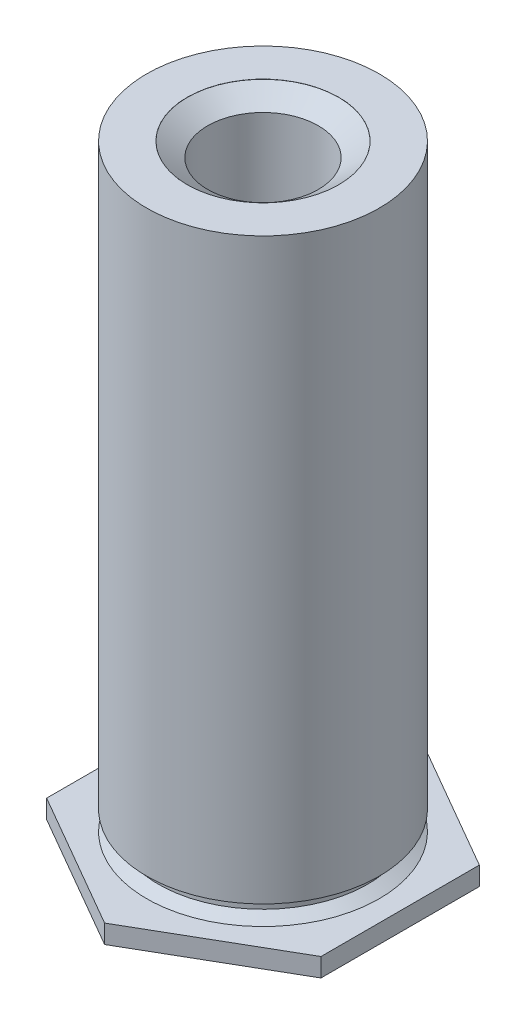
ISO-10303-21;
HEADER;
FILE_DESCRIPTION(('STEP AP214'),'2;1');
FILE_NAME('part.step','',(''),(''),'','','');
FILE_SCHEMA(('AUTOMOTIVE_DESIGN { 1 0 10303 214 1 1 1 1 }'));
ENDSEC;
DATA;
#1=APPLICATION_CONTEXT('core data for automotive mechanical design processes');
#2=APPLICATION_PROTOCOL_DEFINITION('international standard','automotive_design',2000,#1);
#3=PRODUCT_CONTEXT('',#1,'mechanical');
#4=PRODUCT('Part','Part','',(#3));
#5=PRODUCT_RELATED_PRODUCT_CATEGORY('part','',(#4));
#6=PRODUCT_DEFINITION_FORMATION('','',#4);
#7=PRODUCT_DEFINITION_CONTEXT('part definition',#1,'design');
#8=PRODUCT_DEFINITION('design','',#6,#7);
#9=PRODUCT_DEFINITION_SHAPE('','',#8);
#10=(LENGTH_UNIT() NAMED_UNIT(*) SI_UNIT(.MILLI.,.METRE.));
#11=(NAMED_UNIT(*) PLANE_ANGLE_UNIT() SI_UNIT($,.RADIAN.));
#12=(NAMED_UNIT(*) SI_UNIT($,.STERADIAN.) SOLID_ANGLE_UNIT());
#13=UNCERTAINTY_MEASURE_WITH_UNIT(LENGTH_MEASURE(1.E-05),#10,'distance_accuracy_value','');
#14=(GEOMETRIC_REPRESENTATION_CONTEXT(3) GLOBAL_UNCERTAINTY_ASSIGNED_CONTEXT((#13)) GLOBAL_UNIT_ASSIGNED_CONTEXT((#10,
#11,#12)) REPRESENTATION_CONTEXT('',''));
#15=CARTESIAN_POINT('',(0.,0.,0.));
#16=DIRECTION('',(0.,0.,1.));
#17=DIRECTION('',(1.,0.,0.));
#18=AXIS2_PLACEMENT_3D('',#15,#16,#17);
#19=CARTESIAN_POINT('',(3.683,0.430784,0.));
#20=DIRECTION('',(0.,1.,0.));
#21=DIRECTION('',(0.,0.,1.));
#22=AXIS2_PLACEMENT_3D('',#19,#20,#21);
#23=PLANE('',#22);
#24=CARTESIAN_POINT('',(0.,0.430784,0.));
#25=DIRECTION('',(0.,-1.,0.));
#26=DIRECTION('',(0.,0.,-1.));
#27=AXIS2_PLACEMENT_3D('',#24,#25,#26);
#28=CIRCLE('',#27,2.6924);
#29=CARTESIAN_POINT('',(0.,0.430784,-2.6924));
#30=VERTEX_POINT('',#29);
#31=EDGE_CURVE('E11',#30,#30,#28,.T.);
#32=ORIENTED_EDGE('',*,*,#31,.T.);
#33=EDGE_LOOP('',(#32));
#34=FACE_BOUND('',#33,.T.);
#35=DIRECTION('',(0.866025403784439,0.,0.5));
#36=VECTOR('',#35,1.);
#37=CARTESIAN_POINT('',(0.,0.430784,3.66617420935412));
#38=LINE('',#37,#36);
#39=CARTESIAN_POINT('',(-3.175,0.430784,1.83308710467706));
#40=VERTEX_POINT('',#39);
#41=CARTESIAN_POINT('',(0.,0.430784,3.66617420935412));
#42=VERTEX_POINT('',#41);
#43=EDGE_CURVE('E130',#40,#42,#38,.T.);
#44=ORIENTED_EDGE('',*,*,#43,.T.);
#45=DIRECTION('',(0.866025403784439,0.,-0.5));
#46=VECTOR('',#45,1.);
#47=CARTESIAN_POINT('',(3.175,0.430784,1.83308710467706));
#48=LINE('',#47,#46);
#49=CARTESIAN_POINT('',(3.175,0.430784,1.83308710467706));
#50=VERTEX_POINT('',#49);
#51=EDGE_CURVE('E119',#42,#50,#48,.T.);
#52=ORIENTED_EDGE('',*,*,#51,.T.);
#53=DIRECTION('',(0.,0.,-1.));
#54=VECTOR('',#53,1.);
#55=CARTESIAN_POINT('',(3.175,0.430784,-1.83308710467706));
#56=LINE('',#55,#54);
#57=CARTESIAN_POINT('',(3.175,0.430784,-1.83308710467706));
#58=VERTEX_POINT('',#57);
#59=EDGE_CURVE('E122',#50,#58,#56,.T.);
#60=ORIENTED_EDGE('',*,*,#59,.T.);
#61=DIRECTION('',(-0.866025403784439,0.,-0.5));
#62=VECTOR('',#61,1.);
#63=CARTESIAN_POINT('',(0.,0.430784,-3.66617420935412));
#64=LINE('',#63,#62);
#65=CARTESIAN_POINT('',(0.,0.430784,-3.66617420935412));
#66=VERTEX_POINT('',#65);
#67=EDGE_CURVE('E47',#58,#66,#64,.T.);
#68=ORIENTED_EDGE('',*,*,#67,.T.);
#69=DIRECTION('',(-0.866025403784438,0.,0.5));
#70=VECTOR('',#69,1.);
#71=CARTESIAN_POINT('',(-3.175,0.430784,-1.83308710467706));
#72=LINE('',#71,#70);
#73=CARTESIAN_POINT('',(-3.175,0.430784,-1.83308710467706));
#74=VERTEX_POINT('',#73);
#75=EDGE_CURVE('E95',#66,#74,#72,.T.);
#76=ORIENTED_EDGE('',*,*,#75,.T.);
#77=DIRECTION('',(0.,0.,1.));
#78=VECTOR('',#77,1.);
#79=CARTESIAN_POINT('',(-3.175,0.430784,1.83308710467706));
#80=LINE('',#79,#78);
#81=EDGE_CURVE('E127',#74,#40,#80,.T.);
#82=ORIENTED_EDGE('',*,*,#81,.T.);
#83=EDGE_LOOP('',(#44,#52,#60,#68,#76,#82));
#84=FACE_BOUND('',#83,.T.);
#85=ADVANCED_FACE('F32',(#34,#84),#23,.T.);
#86=CARTESIAN_POINT('',(0.,0.430784,0.));
#87=DIRECTION('',(0.,-1.,0.));
#88=DIRECTION('',(0.,0.,-1.));
#89=AXIS2_PLACEMENT_3D('',#86,#87,#88);
#90=CONICAL_SURFACE('',#89,2.6924,1.0471975511966);
#91=CARTESIAN_POINT('',(0.,0.586229786476616,0.));
#92=DIRECTION('',(0.,-1.,0.));
#93=DIRECTION('',(0.,0.,-1.));
#94=AXIS2_PLACEMENT_3D('',#91,#92,#93);
#95=CIRCLE('',#94,2.42316);
#96=CARTESIAN_POINT('',(0.,0.586229786476616,-2.42316));
#97=VERTEX_POINT('',#96);
#98=EDGE_CURVE('E40',#97,#97,#95,.T.);
#99=ORIENTED_EDGE('',*,*,#98,.T.);
#100=EDGE_LOOP('',(#99));
#101=FACE_BOUND('',#100,.T.);
#102=ORIENTED_EDGE('',*,*,#31,.F.);
#103=EDGE_LOOP('',(#102));
#104=FACE_BOUND('',#103,.T.);
#105=ADVANCED_FACE('F170',(#101,#104),#90,.T.);
#106=CARTESIAN_POINT('',(0.,0.,0.));
#107=DIRECTION('',(0.,-1.,0.));
#108=DIRECTION('',(0.,0.,-1.));
#109=AXIS2_PLACEMENT_3D('',#106,#107,#108);
#110=CYLINDRICAL_SURFACE('',#109,2.42316);
#111=CARTESIAN_POINT('',(0.,0.8831072,0.));
#112=DIRECTION('',(0.,-1.,0.));
#113=DIRECTION('',(0.,0.,-1.));
#114=AXIS2_PLACEMENT_3D('',#111,#112,#113);
#115=CIRCLE('',#114,2.42316);
#116=CARTESIAN_POINT('',(0.,0.8831072,-2.42316));
#117=VERTEX_POINT('',#116);
#118=EDGE_CURVE('E164',#117,#117,#115,.T.);
#119=ORIENTED_EDGE('',*,*,#118,.T.);
#120=EDGE_LOOP('',(#119));
#121=FACE_BOUND('',#120,.T.);
#122=ORIENTED_EDGE('',*,*,#98,.F.);
#123=EDGE_LOOP('',(#122));
#124=FACE_BOUND('',#123,.T.);
#125=ADVANCED_FACE('F173',(#121,#124),#110,.T.);
#126=CARTESIAN_POINT('',(2.6924,0.8831072,0.));
#127=DIRECTION('',(0.,-1.,0.));
#128=DIRECTION('',(0.,0.,-1.));
#129=AXIS2_PLACEMENT_3D('',#126,#127,#128);
#130=PLANE('',#129);
#131=CARTESIAN_POINT('',(0.,0.8831072,0.));
#132=DIRECTION('',(0.,-1.,0.));
#133=DIRECTION('',(0.,0.,-1.));
#134=AXIS2_PLACEMENT_3D('',#131,#132,#133);
#135=CIRCLE('',#134,2.6924);
#136=CARTESIAN_POINT('',(0.,0.8831072,-2.6924));
#137=VERTEX_POINT('',#136);
#138=EDGE_CURVE('E161',#137,#137,#135,.T.);
#139=ORIENTED_EDGE('',*,*,#138,.T.);
#140=EDGE_LOOP('',(#139));
#141=FACE_BOUND('',#140,.T.);
#142=ORIENTED_EDGE('',*,*,#118,.F.);
#143=EDGE_LOOP('',(#142));
#144=FACE_BOUND('',#143,.T.);
#145=ADVANCED_FACE('F175',(#141,#144),#130,.T.);
#146=CARTESIAN_POINT('',(0.,0.,0.));
#147=DIRECTION('',(0.,-1.,0.));
#148=DIRECTION('',(0.,0.,-1.));
#149=AXIS2_PLACEMENT_3D('',#146,#147,#148);
#150=CYLINDRICAL_SURFACE('',#149,2.6924);
#151=CARTESIAN_POINT('',(0.,14.2748,0.));
#152=DIRECTION('',(0.,-1.,0.));
#153=DIRECTION('',(0.,0.,-1.));
#154=AXIS2_PLACEMENT_3D('',#151,#152,#153);
#155=CIRCLE('',#154,2.6924);
#156=CARTESIAN_POINT('',(0.,14.2748,-2.6924));
#157=VERTEX_POINT('',#156);
#158=EDGE_CURVE('E158',#157,#157,#155,.T.);
#159=ORIENTED_EDGE('',*,*,#158,.T.);
#160=EDGE_LOOP('',(#159));
#161=FACE_BOUND('',#160,.T.);
#162=ORIENTED_EDGE('',*,*,#138,.F.);
#163=EDGE_LOOP('',(#162));
#164=FACE_BOUND('',#163,.T.);
#165=ADVANCED_FACE('F182',(#161,#164),#150,.T.);
#166=CARTESIAN_POINT('',(2.6924,14.2748,0.));
#167=DIRECTION('',(0.,1.,0.));
#168=DIRECTION('',(0.,0.,1.));
#169=AXIS2_PLACEMENT_3D('',#166,#167,#168);
#170=PLANE('',#169);
#171=CARTESIAN_POINT('',(0.,14.2748,0.));
#172=DIRECTION('',(0.,1.,0.));
#173=DIRECTION('',(0.,0.,1.));
#174=AXIS2_PLACEMENT_3D('',#171,#172,#173);
#175=CIRCLE('',#174,1.75514);
#176=CARTESIAN_POINT('',(0.,14.2748,1.75514));
#177=VERTEX_POINT('',#176);
#178=EDGE_CURVE('E35',#177,#177,#175,.T.);
#179=ORIENTED_EDGE('',*,*,#178,.F.);
#180=EDGE_LOOP('',(#179));
#181=FACE_BOUND('',#180,.T.);
#182=ORIENTED_EDGE('',*,*,#158,.F.);
#183=EDGE_LOOP('',(#182));
#184=FACE_BOUND('',#183,.T.);
#185=ADVANCED_FACE('F229',(#181,#184),#170,.T.);
#186=CARTESIAN_POINT('',(1.75514,14.27226,0.));
#187=DIRECTION('',(0.,-1.,0.));
#188=DIRECTION('',(0.,0.,-1.));
#189=AXIS2_PLACEMENT_3D('',#186,#187,#188);
#190=PLANE('',#189);
#191=CARTESIAN_POINT('',(0.,14.27226,0.));
#192=DIRECTION('',(0.,-1.,0.));
#193=DIRECTION('',(0.,0.,-1.));
#194=AXIS2_PLACEMENT_3D('',#191,#192,#193);
#195=CIRCLE('',#194,1.75514);
#196=CARTESIAN_POINT('',(0.,14.27226,-1.75514));
#197=VERTEX_POINT('',#196);
#198=EDGE_CURVE('E135',#197,#197,#195,.T.);
#199=ORIENTED_EDGE('',*,*,#198,.F.);
#200=EDGE_LOOP('',(#199));
#201=FACE_BOUND('',#200,.T.);
#202=CARTESIAN_POINT('',(0.,14.27226,0.));
#203=DIRECTION('',(0.,-1.,0.));
#204=DIRECTION('',(0.,0.,-1.));
#205=AXIS2_PLACEMENT_3D('',#202,#203,#204);
#206=CIRCLE('',#205,1.7526);
#207=CARTESIAN_POINT('',(0.,14.27226,-1.7526));
#208=VERTEX_POINT('',#207);
#209=EDGE_CURVE('E146',#208,#208,#206,.T.);
#210=ORIENTED_EDGE('',*,*,#209,.T.);
#211=EDGE_LOOP('',(#210));
#212=FACE_BOUND('',#211,.T.);
#213=ADVANCED_FACE('F225',(#201,#212),#190,.F.);
#214=CARTESIAN_POINT('',(0.,13.9415768195347,0.));
#215=DIRECTION('',(0.,1.,0.));
#216=DIRECTION('',(0.,0.,1.));
#217=AXIS2_PLACEMENT_3D('',#214,#215,#216);
#218=CONICAL_SURFACE('',#217,1.28016,0.960105621522079);
#219=ORIENTED_EDGE('',*,*,#209,.F.);
#220=EDGE_LOOP('',(#219));
#221=FACE_BOUND('',#220,.T.);
#222=CARTESIAN_POINT('',(0.,13.9415768195347,0.));
#223=DIRECTION('',(0.,-1.,0.));
#224=DIRECTION('',(0.,0.,-1.));
#225=AXIS2_PLACEMENT_3D('',#222,#223,#224);
#226=CIRCLE('',#225,1.28016);
#227=CARTESIAN_POINT('',(0.,13.9415768195347,-1.28016));
#228=VERTEX_POINT('',#227);
#229=EDGE_CURVE('E143',#228,#228,#226,.T.);
#230=ORIENTED_EDGE('',*,*,#229,.T.);
#231=EDGE_LOOP('',(#230));
#232=FACE_BOUND('',#231,.T.);
#233=ADVANCED_FACE('F221',(#221,#232),#218,.F.);
#234=CARTESIAN_POINT('',(0.,-2.54,0.));
#235=DIRECTION('',(0.,-1.,0.));
#236=DIRECTION('',(0.,0.,-1.));
#237=AXIS2_PLACEMENT_3D('',#234,#235,#236);
#238=CYLINDRICAL_SURFACE('',#237,1.75514);
#239=ORIENTED_EDGE('',*,*,#178,.T.);
#240=EDGE_LOOP('',(#239));
#241=FACE_BOUND('',#240,.T.);
#242=ORIENTED_EDGE('',*,*,#198,.T.);
#243=EDGE_LOOP('',(#242));
#244=FACE_BOUND('',#243,.T.);
#245=ADVANCED_FACE('F217',(#241,#244),#238,.F.);
#246=CARTESIAN_POINT('',(0.,2.92414036599246,0.));
#247=DIRECTION('',(0.,1.,0.));
#248=DIRECTION('',(0.,0.,1.));
#249=AXIS2_PLACEMENT_3D('',#246,#247,#248);
#250=CONICAL_SURFACE('',#249,0.,1.17809724509617);
#251=CARTESIAN_POINT('',(0.,3.4544,0.));
#252=DIRECTION('',(0.,-1.,0.));
#253=DIRECTION('',(0.,0.,-1.));
#254=AXIS2_PLACEMENT_3D('',#251,#252,#253);
#255=CIRCLE('',#254,1.28016);
#256=CARTESIAN_POINT('',(0.,3.4544,-1.28016));
#257=VERTEX_POINT('',#256);
#258=EDGE_CURVE('E149',#257,#257,#255,.T.);
#259=ORIENTED_EDGE('',*,*,#258,.F.);
#260=EDGE_LOOP('',(#259));
#261=FACE_BOUND('',#260,.T.);
#262=CARTESIAN_POINT('',(0.,2.92414036599246,0.));
#263=VERTEX_POINT('',#262);
#264=VERTEX_LOOP('',#263);
#265=FACE_BOUND('',#264,.T.);
#266=ADVANCED_FACE('F220',(#261,#265),#250,.F.);
#267=CARTESIAN_POINT('',(0.,0.,0.));
#268=DIRECTION('',(0.,-1.,0.));
#269=DIRECTION('',(0.,0.,-1.));
#270=AXIS2_PLACEMENT_3D('',#267,#268,#269);
#271=CYLINDRICAL_SURFACE('',#270,1.28016);
#272=ORIENTED_EDGE('',*,*,#229,.F.);
#273=EDGE_LOOP('',(#272));
#274=FACE_BOUND('',#273,.T.);
#275=ORIENTED_EDGE('',*,*,#258,.T.);
#276=EDGE_LOOP('',(#275));
#277=FACE_BOUND('',#276,.T.);
#278=ADVANCED_FACE('F216',(#274,#277),#271,.F.);
#279=CARTESIAN_POINT('',(3.175,0.,1.83308710467706));
#280=DIRECTION('',(0.5,0.,0.866025403784439));
#281=DIRECTION('',(0.866025403784439,0.,-0.5));
#282=AXIS2_PLACEMENT_3D('',#279,#280,#281);
#283=PLANE('',#282);
#284=ORIENTED_EDGE('',*,*,#51,.F.);
#285=DIRECTION('',(0.,1.,0.));
#286=VECTOR('',#285,1.);
#287=CARTESIAN_POINT('',(0.,0.,3.66617420935412));
#288=LINE('',#287,#286);
#289=CARTESIAN_POINT('',(0.,0.,3.66617420935412));
#290=VERTEX_POINT('',#289);
#291=EDGE_CURVE('E133',#290,#42,#288,.T.);
#292=ORIENTED_EDGE('',*,*,#291,.F.);
#293=DIRECTION('',(0.866025403784439,0.,-0.5));
#294=VECTOR('',#293,1.);
#295=CARTESIAN_POINT('',(3.175,0.,1.83308710467706));
#296=LINE('',#295,#294);
#297=CARTESIAN_POINT('',(3.175,0.,1.83308710467706));
#298=VERTEX_POINT('',#297);
#299=EDGE_CURVE('E55',#290,#298,#296,.T.);
#300=ORIENTED_EDGE('',*,*,#299,.T.);
#301=DIRECTION('',(0.,1.,0.));
#302=VECTOR('',#301,1.);
#303=CARTESIAN_POINT('',(3.175,0.,1.83308710467706));
#304=LINE('',#303,#302);
#305=EDGE_CURVE('E118',#298,#50,#304,.T.);
#306=ORIENTED_EDGE('',*,*,#305,.T.);
#307=EDGE_LOOP('',(#284,#292,#300,#306));
#308=FACE_BOUND('',#307,.T.);
#309=ADVANCED_FACE('F196',(#308),#283,.T.);
#310=CARTESIAN_POINT('',(0.,0.,3.66617420935412));
#311=DIRECTION('',(-0.5,0.,0.866025403784439));
#312=DIRECTION('',(0.866025403784439,0.,0.5));
#313=AXIS2_PLACEMENT_3D('',#310,#311,#312);
#314=PLANE('',#313);
#315=ORIENTED_EDGE('',*,*,#43,.F.);
#316=DIRECTION('',(0.,1.,0.));
#317=VECTOR('',#316,1.);
#318=CARTESIAN_POINT('',(-3.175,0.,1.83308710467706));
#319=LINE('',#318,#317);
#320=CARTESIAN_POINT('',(-3.175,0.,1.83308710467706));
#321=VERTEX_POINT('',#320);
#322=EDGE_CURVE('E136',#321,#40,#319,.T.);
#323=ORIENTED_EDGE('',*,*,#322,.F.);
#324=DIRECTION('',(0.866025403784439,0.,0.5));
#325=VECTOR('',#324,1.);
#326=CARTESIAN_POINT('',(0.,0.,3.66617420935412));
#327=LINE('',#326,#325);
#328=EDGE_CURVE('E112',#321,#290,#327,.T.);
#329=ORIENTED_EDGE('',*,*,#328,.T.);
#330=ORIENTED_EDGE('',*,*,#291,.T.);
#331=EDGE_LOOP('',(#315,#323,#329,#330));
#332=FACE_BOUND('',#331,.T.);
#333=ADVANCED_FACE('F195',(#332),#314,.T.);
#334=CARTESIAN_POINT('',(-3.175,0.,1.83308710467706));
#335=DIRECTION('',(-1.,0.,0.));
#336=DIRECTION('',(0.,0.,1.));
#337=AXIS2_PLACEMENT_3D('',#334,#335,#336);
#338=PLANE('',#337);
#339=ORIENTED_EDGE('',*,*,#81,.F.);
#340=DIRECTION('',(0.,1.,0.));
#341=VECTOR('',#340,1.);
#342=CARTESIAN_POINT('',(-3.175,0.,-1.83308710467706));
#343=LINE('',#342,#341);
#344=CARTESIAN_POINT('',(-3.175,0.,-1.83308710467706));
#345=VERTEX_POINT('',#344);
#346=EDGE_CURVE('E96',#345,#74,#343,.T.);
#347=ORIENTED_EDGE('',*,*,#346,.F.);
#348=DIRECTION('',(0.,0.,1.));
#349=VECTOR('',#348,1.);
#350=CARTESIAN_POINT('',(-3.175,0.,1.83308710467706));
#351=LINE('',#350,#349);
#352=EDGE_CURVE('E110',#345,#321,#351,.T.);
#353=ORIENTED_EDGE('',*,*,#352,.T.);
#354=ORIENTED_EDGE('',*,*,#322,.T.);
#355=EDGE_LOOP('',(#339,#347,#353,#354));
#356=FACE_BOUND('',#355,.T.);
#357=ADVANCED_FACE('F294',(#356),#338,.T.);
#358=CARTESIAN_POINT('',(-3.175,0.,-1.83308710467706));
#359=DIRECTION('',(-0.5,0.,-0.866025403784438));
#360=DIRECTION('',(-0.866025403784439,0.,0.5));
#361=AXIS2_PLACEMENT_3D('',#358,#359,#360);
#362=PLANE('',#361);
#363=ORIENTED_EDGE('',*,*,#75,.F.);
#364=DIRECTION('',(0.,1.,0.));
#365=VECTOR('',#364,1.);
#366=CARTESIAN_POINT('',(0.,0.,-3.66617420935412));
#367=LINE('',#366,#365);
#368=CARTESIAN_POINT('',(0.,0.,-3.66617420935412));
#369=VERTEX_POINT('',#368);
#370=EDGE_CURVE('E88',#369,#66,#367,.T.);
#371=ORIENTED_EDGE('',*,*,#370,.F.);
#372=DIRECTION('',(-0.866025403784438,0.,0.5));
#373=VECTOR('',#372,1.);
#374=CARTESIAN_POINT('',(-3.175,0.,-1.83308710467706));
#375=LINE('',#374,#373);
#376=EDGE_CURVE('E92',#369,#345,#375,.T.);
#377=ORIENTED_EDGE('',*,*,#376,.T.);
#378=ORIENTED_EDGE('',*,*,#346,.T.);
#379=EDGE_LOOP('',(#363,#371,#377,#378));
#380=FACE_BOUND('',#379,.T.);
#381=ADVANCED_FACE('F90',(#380),#362,.T.);
#382=CARTESIAN_POINT('',(0.,0.,-3.66617420935412));
#383=DIRECTION('',(0.5,0.,-0.866025403784439));
#384=DIRECTION('',(-0.866025403784439,0.,-0.5));
#385=AXIS2_PLACEMENT_3D('',#382,#383,#384);
#386=PLANE('',#385);
#387=ORIENTED_EDGE('',*,*,#67,.F.);
#388=DIRECTION('',(0.,1.,0.));
#389=VECTOR('',#388,1.);
#390=CARTESIAN_POINT('',(3.175,0.,-1.83308710467706));
#391=LINE('',#390,#389);
#392=CARTESIAN_POINT('',(3.175,0.,-1.83308710467706));
#393=VERTEX_POINT('',#392);
#394=EDGE_CURVE('E97',#393,#58,#391,.T.);
#395=ORIENTED_EDGE('',*,*,#394,.F.);
#396=DIRECTION('',(-0.866025403784439,0.,-0.5));
#397=VECTOR('',#396,1.);
#398=CARTESIAN_POINT('',(0.,0.,-3.66617420935412));
#399=LINE('',#398,#397);
#400=EDGE_CURVE('E100',#393,#369,#399,.T.);
#401=ORIENTED_EDGE('',*,*,#400,.T.);
#402=ORIENTED_EDGE('',*,*,#370,.T.);
#403=EDGE_LOOP('',(#387,#395,#401,#402));
#404=FACE_BOUND('',#403,.T.);
#405=ADVANCED_FACE('F101',(#404),#386,.T.);
#406=CARTESIAN_POINT('',(3.175,0.,-1.83308710467706));
#407=DIRECTION('',(1.,0.,0.));
#408=DIRECTION('',(0.,0.,-1.));
#409=AXIS2_PLACEMENT_3D('',#406,#407,#408);
#410=PLANE('',#409);
#411=ORIENTED_EDGE('',*,*,#59,.F.);
#412=ORIENTED_EDGE('',*,*,#305,.F.);
#413=DIRECTION('',(0.,0.,-1.));
#414=VECTOR('',#413,1.);
#415=CARTESIAN_POINT('',(3.175,0.,-1.83308710467706));
#416=LINE('',#415,#414);
#417=EDGE_CURVE('E105',#298,#393,#416,.T.);
#418=ORIENTED_EDGE('',*,*,#417,.T.);
#419=ORIENTED_EDGE('',*,*,#394,.T.);
#420=EDGE_LOOP('',(#411,#412,#418,#419));
#421=FACE_BOUND('',#420,.T.);
#422=ADVANCED_FACE('F199',(#421),#410,.T.);
#423=CARTESIAN_POINT('',(2.6924,0.00253999999999981,0.));
#424=DIRECTION('',(0.,-1.,0.));
#425=DIRECTION('',(0.,0.,-1.));
#426=AXIS2_PLACEMENT_3D('',#423,#424,#425);
#427=PLANE('',#426);
#428=CARTESIAN_POINT('',(0.,0.00254000000000007,0.));
#429=DIRECTION('',(0.,-1.,0.));
#430=DIRECTION('',(0.,0.,-1.));
#431=AXIS2_PLACEMENT_3D('',#428,#429,#430);
#432=CIRCLE('',#431,2.6924);
#433=CARTESIAN_POINT('',(0.,0.00254000000000007,-2.6924));
#434=VERTEX_POINT('',#433);
#435=EDGE_CURVE('E155',#434,#434,#432,.T.);
#436=ORIENTED_EDGE('',*,*,#435,.T.);
#437=EDGE_LOOP('',(#436));
#438=FACE_BOUND('',#437,.T.);
#439=ADVANCED_FACE('F202',(#438),#427,.T.);
#440=CARTESIAN_POINT('',(0.,0.,0.));
#441=DIRECTION('',(0.,-1.,0.));
#442=DIRECTION('',(0.,0.,-1.));
#443=AXIS2_PLACEMENT_3D('',#440,#441,#442);
#444=CYLINDRICAL_SURFACE('',#443,2.6924);
#445=CARTESIAN_POINT('',(0.,0.,0.));
#446=DIRECTION('',(0.,-1.,0.));
#447=DIRECTION('',(0.,0.,-1.));
#448=AXIS2_PLACEMENT_3D('',#445,#446,#447);
#449=CIRCLE('',#448,2.6924);
#450=CARTESIAN_POINT('',(0.,0.,-2.6924));
#451=VERTEX_POINT('',#450);
#452=EDGE_CURVE('E152',#451,#451,#449,.T.);
#453=ORIENTED_EDGE('',*,*,#452,.T.);
#454=EDGE_LOOP('',(#453));
#455=FACE_BOUND('',#454,.T.);
#456=ORIENTED_EDGE('',*,*,#435,.F.);
#457=EDGE_LOOP('',(#456));
#458=FACE_BOUND('',#457,.T.);
#459=ADVANCED_FACE('F208',(#455,#458),#444,.F.);
#460=CARTESIAN_POINT('',(2.6924,0.,0.));
#461=DIRECTION('',(0.,-1.,0.));
#462=DIRECTION('',(0.,0.,-1.));
#463=AXIS2_PLACEMENT_3D('',#460,#461,#462);
#464=PLANE('',#463);
#465=ORIENTED_EDGE('',*,*,#452,.F.);
#466=EDGE_LOOP('',(#465));
#467=FACE_BOUND('',#466,.T.);
#468=ORIENTED_EDGE('',*,*,#417,.F.);
#469=ORIENTED_EDGE('',*,*,#299,.F.);
#470=ORIENTED_EDGE('',*,*,#328,.F.);
#471=ORIENTED_EDGE('',*,*,#352,.F.);
#472=ORIENTED_EDGE('',*,*,#376,.F.);
#473=ORIENTED_EDGE('',*,*,#400,.F.);
#474=EDGE_LOOP('',(#468,#469,#470,#471,#472,#473));
#475=FACE_BOUND('',#474,.T.);
#476=ADVANCED_FACE('F107',(#467,#475),#464,.T.);
#477=CLOSED_SHELL('',(#85,#105,#125,#145,#165,#185,#213,#233,#245,#266,#278,#309,#333,#357,#381,
#405,#422,#439,#459,#476));
#478=MANIFOLD_SOLID_BREP('B2',#477);
#479=ADVANCED_BREP_SHAPE_REPRESENTATION('',(#18,#478),#14);
#480=SHAPE_DEFINITION_REPRESENTATION(#9,#479);
ENDSEC;
END-ISO-10303-21;
